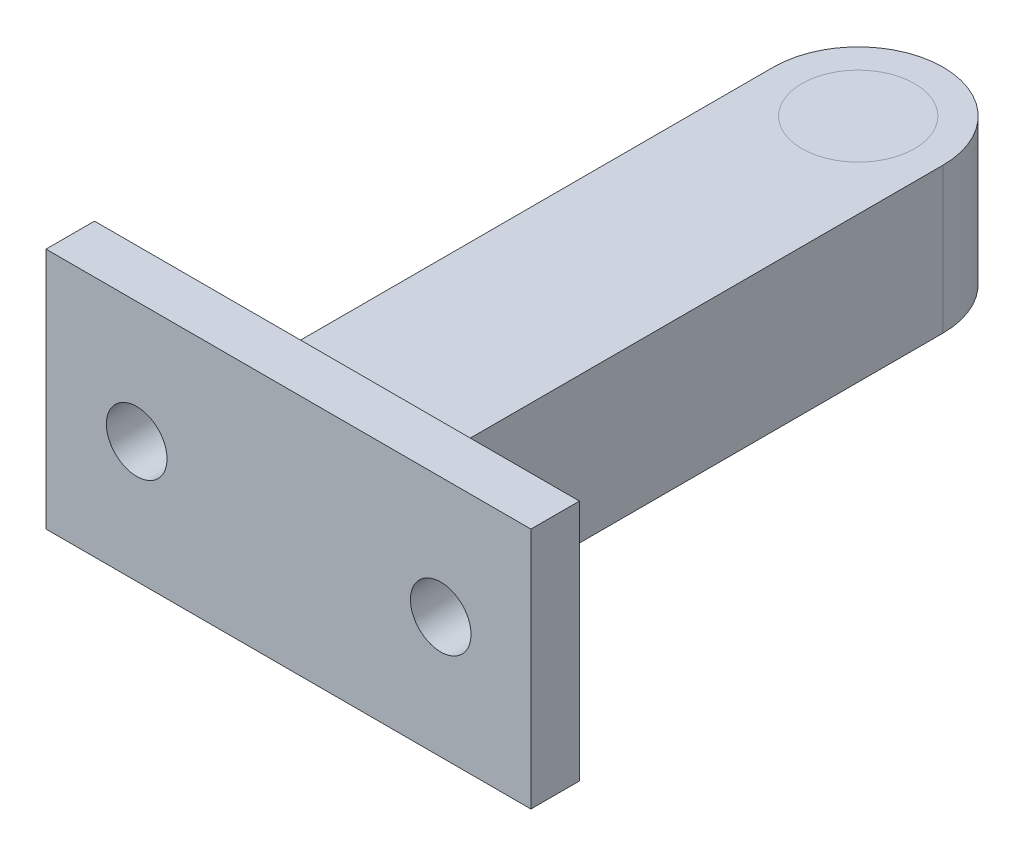
ISO-10303-21;
HEADER;
FILE_DESCRIPTION(('STEP AP214'),'2;1');
FILE_NAME('part.step','',(''),(''),'','','');
FILE_SCHEMA(('AUTOMOTIVE_DESIGN { 1 0 10303 214 1 1 1 1 }'));
ENDSEC;
DATA;
#1=APPLICATION_CONTEXT('core data for automotive mechanical design processes');
#2=APPLICATION_PROTOCOL_DEFINITION('international standard','automotive_design',2000,#1);
#3=PRODUCT_CONTEXT('',#1,'mechanical');
#4=PRODUCT('Part','Part','',(#3));
#5=PRODUCT_RELATED_PRODUCT_CATEGORY('part','',(#4));
#6=PRODUCT_DEFINITION_FORMATION('','',#4);
#7=PRODUCT_DEFINITION_CONTEXT('part definition',#1,'design');
#8=PRODUCT_DEFINITION('design','',#6,#7);
#9=PRODUCT_DEFINITION_SHAPE('','',#8);
#10=(LENGTH_UNIT() NAMED_UNIT(*) SI_UNIT(.MILLI.,.METRE.));
#11=(NAMED_UNIT(*) PLANE_ANGLE_UNIT() SI_UNIT($,.RADIAN.));
#12=(NAMED_UNIT(*) SI_UNIT($,.STERADIAN.) SOLID_ANGLE_UNIT());
#13=UNCERTAINTY_MEASURE_WITH_UNIT(LENGTH_MEASURE(1.E-05),#10,'distance_accuracy_value','');
#14=(GEOMETRIC_REPRESENTATION_CONTEXT(3) GLOBAL_UNCERTAINTY_ASSIGNED_CONTEXT((#13)) GLOBAL_UNIT_ASSIGNED_CONTEXT((#10,
#11,#12)) REPRESENTATION_CONTEXT('',''));
#15=CARTESIAN_POINT('',(0.,0.,0.));
#16=DIRECTION('',(0.,0.,1.));
#17=DIRECTION('',(1.,0.,0.));
#18=AXIS2_PLACEMENT_3D('',#15,#16,#17);
#19=CARTESIAN_POINT('',(0.,5.5,0.));
#20=DIRECTION('',(0.,1.,0.));
#21=DIRECTION('',(0.,0.,1.));
#22=AXIS2_PLACEMENT_3D('',#19,#20,#21);
#23=CYLINDRICAL_SURFACE('',#22,2.325);
#24=CARTESIAN_POINT('',(0.,5.5,0.));
#25=DIRECTION('',(0.,1.,0.));
#26=DIRECTION('',(0.,0.,1.));
#27=AXIS2_PLACEMENT_3D('',#24,#25,#26);
#28=CIRCLE('',#27,2.325);
#29=CARTESIAN_POINT('',(0.,5.5,2.325));
#30=VERTEX_POINT('',#29);
#31=EDGE_CURVE('E11',#30,#30,#28,.T.);
#32=ORIENTED_EDGE('',*,*,#31,.T.);
#33=EDGE_LOOP('',(#32));
#34=FACE_BOUND('',#33,.T.);
#35=CARTESIAN_POINT('',(0.,6.,0.));
#36=DIRECTION('',(0.,1.,0.));
#37=DIRECTION('',(0.,0.,1.));
#38=AXIS2_PLACEMENT_3D('',#35,#36,#37);
#39=CIRCLE('',#38,2.325);
#40=CARTESIAN_POINT('',(0.,6.,2.325));
#41=VERTEX_POINT('',#40);
#42=EDGE_CURVE('E58',#41,#41,#39,.T.);
#43=ORIENTED_EDGE('',*,*,#42,.F.);
#44=EDGE_LOOP('',(#43));
#45=FACE_BOUND('',#44,.T.);
#46=ADVANCED_FACE('F55',(#34,#45),#23,.T.);
#47=CARTESIAN_POINT('',(0.,5.5,0.));
#48=DIRECTION('',(0.,1.,0.));
#49=DIRECTION('',(0.,0.,1.));
#50=AXIS2_PLACEMENT_3D('',#47,#48,#49);
#51=PLANE('',#50);
#52=ORIENTED_EDGE('',*,*,#31,.F.);
#53=EDGE_LOOP('',(#52));
#54=FACE_BOUND('',#53,.T.);
#55=ADVANCED_FACE('F70',(#54),#51,.F.);
#56=CARTESIAN_POINT('',(0.,6.,0.));
#57=DIRECTION('',(0.,1.,0.));
#58=DIRECTION('',(0.,0.,1.));
#59=AXIS2_PLACEMENT_3D('',#56,#57,#58);
#60=PLANE('',#59);
#61=ORIENTED_EDGE('',*,*,#42,.T.);
#62=EDGE_LOOP('',(#61));
#63=FACE_BOUND('',#62,.T.);
#64=ADVANCED_FACE('F67',(#63),#60,.T.);
#65=CLOSED_SHELL('',(#46,#55,#64));
#66=MANIFOLD_SOLID_BREP('B2',#65);
#67=CARTESIAN_POINT('',(0.,0.,23.5));
#68=DIRECTION('',(0.,0.,1.));
#69=DIRECTION('',(1.,0.,0.));
#70=AXIS2_PLACEMENT_3D('',#67,#68,#69);
#71=PLANE('',#70);
#72=DIRECTION('',(0.,-1.,0.));
#73=VECTOR('',#72,1.);
#74=CARTESIAN_POINT('',(-10.,8.,23.5));
#75=LINE('',#74,#73);
#76=CARTESIAN_POINT('',(-10.,8.,23.5));
#77=VERTEX_POINT('',#76);
#78=CARTESIAN_POINT('',(-10.,-2.,23.5));
#79=VERTEX_POINT('',#78);
#80=EDGE_CURVE('E181',#77,#79,#75,.T.);
#81=ORIENTED_EDGE('',*,*,#80,.T.);
#82=DIRECTION('',(1.,0.,0.));
#83=VECTOR('',#82,1.);
#84=CARTESIAN_POINT('',(-10.,-2.,23.5));
#85=LINE('',#84,#83);
#86=CARTESIAN_POINT('',(10.,-2.,23.5));
#87=VERTEX_POINT('',#86);
#88=EDGE_CURVE('E169',#79,#87,#85,.T.);
#89=ORIENTED_EDGE('',*,*,#88,.T.);
#90=DIRECTION('',(0.,1.,0.));
#91=VECTOR('',#90,1.);
#92=CARTESIAN_POINT('',(10.,8.,23.5));
#93=LINE('',#92,#91);
#94=CARTESIAN_POINT('',(10.,8.,23.5));
#95=VERTEX_POINT('',#94);
#96=EDGE_CURVE('E180',#87,#95,#93,.T.);
#97=ORIENTED_EDGE('',*,*,#96,.T.);
#98=DIRECTION('',(-1.,0.,0.));
#99=VECTOR('',#98,1.);
#100=CARTESIAN_POINT('',(-10.,8.,23.5));
#101=LINE('',#100,#99);
#102=EDGE_CURVE('E186',#95,#77,#101,.T.);
#103=ORIENTED_EDGE('',*,*,#102,.T.);
#104=EDGE_LOOP('',(#81,#89,#97,#103));
#105=FACE_BOUND('',#104,.T.);
#106=CARTESIAN_POINT('',(-6.25766850005676,3.,23.5));
#107=DIRECTION('',(0.,0.,-1.));
#108=DIRECTION('',(-1.,0.,0.));
#109=AXIS2_PLACEMENT_3D('',#106,#107,#108);
#110=CIRCLE('',#109,1.25);
#111=CARTESIAN_POINT('',(-7.50766850005676,3.,23.5));
#112=VERTEX_POINT('',#111);
#113=EDGE_CURVE('E309',#112,#112,#110,.T.);
#114=ORIENTED_EDGE('',*,*,#113,.T.);
#115=EDGE_LOOP('',(#114));
#116=FACE_BOUND('',#115,.T.);
#117=CARTESIAN_POINT('',(6.28106165332799,3.,23.5));
#118=DIRECTION('',(0.,0.,-1.));
#119=DIRECTION('',(-1.,0.,0.));
#120=AXIS2_PLACEMENT_3D('',#117,#118,#119);
#121=CIRCLE('',#120,1.25);
#122=CARTESIAN_POINT('',(5.03106165332799,3.,23.5));
#123=VERTEX_POINT('',#122);
#124=EDGE_CURVE('E296',#123,#123,#121,.T.);
#125=ORIENTED_EDGE('',*,*,#124,.T.);
#126=EDGE_LOOP('',(#125));
#127=FACE_BOUND('',#126,.T.);
#128=ADVANCED_FACE('F96',(#105,#116,#127),#71,.T.);
#129=CARTESIAN_POINT('',(3.5,6.,0.));
#130=DIRECTION('',(1.,0.,0.));
#131=DIRECTION('',(0.,0.,-1.));
#132=AXIS2_PLACEMENT_3D('',#129,#130,#131);
#133=PLANE('',#132);
#134=DIRECTION('',(0.,0.,1.));
#135=VECTOR('',#134,1.);
#136=CARTESIAN_POINT('',(3.5,0.,0.));
#137=LINE('',#136,#135);
#138=CARTESIAN_POINT('',(3.5,0.,0.));
#139=VERTEX_POINT('',#138);
#140=CARTESIAN_POINT('',(3.5,0.,21.5));
#141=VERTEX_POINT('',#140);
#142=EDGE_CURVE('E202',#139,#141,#137,.T.);
#143=ORIENTED_EDGE('',*,*,#142,.F.);
#144=DIRECTION('',(0.,-1.,0.));
#145=VECTOR('',#144,1.);
#146=CARTESIAN_POINT('',(3.5,6.,0.));
#147=LINE('',#146,#145);
#148=CARTESIAN_POINT('',(3.5,6.,0.));
#149=VERTEX_POINT('',#148);
#150=EDGE_CURVE('E53',#149,#139,#147,.T.);
#151=ORIENTED_EDGE('',*,*,#150,.F.);
#152=DIRECTION('',(0.,0.,1.));
#153=VECTOR('',#152,1.);
#154=CARTESIAN_POINT('',(3.5,6.,0.));
#155=LINE('',#154,#153);
#156=CARTESIAN_POINT('',(3.5,6.,21.5));
#157=VERTEX_POINT('',#156);
#158=EDGE_CURVE('E212',#149,#157,#155,.T.);
#159=ORIENTED_EDGE('',*,*,#158,.T.);
#160=DIRECTION('',(0.,-1.,0.));
#161=VECTOR('',#160,1.);
#162=CARTESIAN_POINT('',(3.5,6.,21.5));
#163=LINE('',#162,#161);
#164=EDGE_CURVE('E135',#157,#141,#163,.T.);
#165=ORIENTED_EDGE('',*,*,#164,.T.);
#166=EDGE_LOOP('',(#143,#151,#159,#165));
#167=FACE_BOUND('',#166,.T.);
#168=ADVANCED_FACE('F249',(#167),#133,.T.);
#169=CARTESIAN_POINT('',(0.,6.,0.));
#170=DIRECTION('',(0.,-1.,0.));
#171=DIRECTION('',(0.,0.,-1.));
#172=AXIS2_PLACEMENT_3D('',#169,#170,#171);
#173=CYLINDRICAL_SURFACE('',#172,3.5);
#174=CARTESIAN_POINT('',(0.,0.,0.));
#175=DIRECTION('',(0.,1.,0.));
#176=DIRECTION('',(0.,0.,1.));
#177=AXIS2_PLACEMENT_3D('',#174,#175,#176);
#178=CIRCLE('',#177,3.5);
#179=CARTESIAN_POINT('',(-3.5,0.,0.));
#180=VERTEX_POINT('',#179);
#181=EDGE_CURVE('E227',#139,#180,#178,.T.);
#182=ORIENTED_EDGE('',*,*,#181,.T.);
#183=DIRECTION('',(0.,-1.,0.));
#184=VECTOR('',#183,1.);
#185=CARTESIAN_POINT('',(-3.5,6.,0.));
#186=LINE('',#185,#184);
#187=CARTESIAN_POINT('',(-3.5,6.,0.));
#188=VERTEX_POINT('',#187);
#189=EDGE_CURVE('E106',#188,#180,#186,.T.);
#190=ORIENTED_EDGE('',*,*,#189,.F.);
#191=CARTESIAN_POINT('',(0.,6.,0.));
#192=DIRECTION('',(0.,1.,0.));
#193=DIRECTION('',(0.,0.,1.));
#194=AXIS2_PLACEMENT_3D('',#191,#192,#193);
#195=CIRCLE('',#194,3.5);
#196=EDGE_CURVE('E216',#149,#188,#195,.T.);
#197=ORIENTED_EDGE('',*,*,#196,.F.);
#198=ORIENTED_EDGE('',*,*,#150,.T.);
#199=EDGE_LOOP('',(#182,#190,#197,#198));
#200=FACE_BOUND('',#199,.T.);
#201=ADVANCED_FACE('F247',(#200),#173,.T.);
#202=CARTESIAN_POINT('',(-3.5,6.,0.));
#203=DIRECTION('',(1.,0.,0.));
#204=DIRECTION('',(0.,0.,-1.));
#205=AXIS2_PLACEMENT_3D('',#202,#203,#204);
#206=PLANE('',#205);
#207=DIRECTION('',(0.,0.,1.));
#208=VECTOR('',#207,1.);
#209=CARTESIAN_POINT('',(-3.5,0.,0.));
#210=LINE('',#209,#208);
#211=CARTESIAN_POINT('',(-3.5,0.,21.5));
#212=VERTEX_POINT('',#211);
#213=EDGE_CURVE('E128',#180,#212,#210,.T.);
#214=ORIENTED_EDGE('',*,*,#213,.T.);
#215=DIRECTION('',(0.,-1.,0.));
#216=VECTOR('',#215,1.);
#217=CARTESIAN_POINT('',(-3.5,6.,21.5));
#218=LINE('',#217,#216);
#219=CARTESIAN_POINT('',(-3.5,6.,21.5));
#220=VERTEX_POINT('',#219);
#221=EDGE_CURVE('E238',#220,#212,#218,.T.);
#222=ORIENTED_EDGE('',*,*,#221,.F.);
#223=DIRECTION('',(0.,0.,1.));
#224=VECTOR('',#223,1.);
#225=CARTESIAN_POINT('',(-3.5,6.,0.));
#226=LINE('',#225,#224);
#227=EDGE_CURVE('E220',#188,#220,#226,.T.);
#228=ORIENTED_EDGE('',*,*,#227,.F.);
#229=ORIENTED_EDGE('',*,*,#189,.T.);
#230=EDGE_LOOP('',(#214,#222,#228,#229));
#231=FACE_BOUND('',#230,.T.);
#232=ADVANCED_FACE('F244',(#231),#206,.F.);
#233=CARTESIAN_POINT('',(0.,6.,0.));
#234=DIRECTION('',(0.,-1.,0.));
#235=DIRECTION('',(0.,0.,-1.));
#236=AXIS2_PLACEMENT_3D('',#233,#234,#235);
#237=CYLINDRICAL_SURFACE('',#236,2.325);
#238=CARTESIAN_POINT('',(0.,6.,0.));
#239=DIRECTION('',(0.,1.,0.));
#240=DIRECTION('',(0.,0.,1.));
#241=AXIS2_PLACEMENT_3D('',#238,#239,#240);
#242=CIRCLE('',#241,2.325);
#243=CARTESIAN_POINT('',(0.,6.,2.325));
#244=VERTEX_POINT('',#243);
#245=EDGE_CURVE('E208',#244,#244,#242,.T.);
#246=ORIENTED_EDGE('',*,*,#245,.T.);
#247=EDGE_LOOP('',(#246));
#248=FACE_BOUND('',#247,.T.);
#249=CARTESIAN_POINT('',(0.,0.,0.));
#250=DIRECTION('',(0.,1.,0.));
#251=DIRECTION('',(0.,0.,1.));
#252=AXIS2_PLACEMENT_3D('',#249,#250,#251);
#253=CIRCLE('',#252,2.325);
#254=CARTESIAN_POINT('',(0.,0.,2.325));
#255=VERTEX_POINT('',#254);
#256=EDGE_CURVE('E197',#255,#255,#253,.T.);
#257=ORIENTED_EDGE('',*,*,#256,.F.);
#258=EDGE_LOOP('',(#257));
#259=FACE_BOUND('',#258,.T.);
#260=ADVANCED_FACE('F98',(#248,#259),#237,.F.);
#261=CARTESIAN_POINT('',(0.,6.,0.));
#262=DIRECTION('',(0.,1.,0.));
#263=DIRECTION('',(0.,0.,1.));
#264=AXIS2_PLACEMENT_3D('',#261,#262,#263);
#265=PLANE('',#264);
#266=ORIENTED_EDGE('',*,*,#245,.F.);
#267=EDGE_LOOP('',(#266));
#268=FACE_BOUND('',#267,.T.);
#269=ORIENTED_EDGE('',*,*,#158,.F.);
#270=ORIENTED_EDGE('',*,*,#196,.T.);
#271=ORIENTED_EDGE('',*,*,#227,.T.);
#272=DIRECTION('',(1.,0.,0.));
#273=VECTOR('',#272,1.);
#274=CARTESIAN_POINT('',(0.,6.,21.5));
#275=LINE('',#274,#273);
#276=EDGE_CURVE('E114',#220,#157,#275,.T.);
#277=ORIENTED_EDGE('',*,*,#276,.T.);
#278=EDGE_LOOP('',(#269,#270,#271,#277));
#279=FACE_BOUND('',#278,.T.);
#280=ADVANCED_FACE('F264',(#268,#279),#265,.T.);
#281=CARTESIAN_POINT('',(0.,0.,0.));
#282=DIRECTION('',(0.,1.,0.));
#283=DIRECTION('',(0.,0.,1.));
#284=AXIS2_PLACEMENT_3D('',#281,#282,#283);
#285=PLANE('',#284);
#286=ORIENTED_EDGE('',*,*,#256,.T.);
#287=EDGE_LOOP('',(#286));
#288=FACE_BOUND('',#287,.T.);
#289=ORIENTED_EDGE('',*,*,#142,.T.);
#290=DIRECTION('',(1.,0.,0.));
#291=VECTOR('',#290,1.);
#292=CARTESIAN_POINT('',(0.,0.,21.5));
#293=LINE('',#292,#291);
#294=EDGE_CURVE('E213',#212,#141,#293,.T.);
#295=ORIENTED_EDGE('',*,*,#294,.F.);
#296=ORIENTED_EDGE('',*,*,#213,.F.);
#297=ORIENTED_EDGE('',*,*,#181,.F.);
#298=EDGE_LOOP('',(#289,#295,#296,#297));
#299=FACE_BOUND('',#298,.T.);
#300=ADVANCED_FACE('F248',(#288,#299),#285,.F.);
#301=CARTESIAN_POINT('',(0.,0.,21.5));
#302=DIRECTION('',(0.,0.,1.));
#303=DIRECTION('',(1.,0.,0.));
#304=AXIS2_PLACEMENT_3D('',#301,#302,#303);
#305=PLANE('',#304);
#306=CARTESIAN_POINT('',(6.28106165332799,3.,21.5));
#307=DIRECTION('',(0.,0.,-1.));
#308=DIRECTION('',(-1.,0.,0.));
#309=AXIS2_PLACEMENT_3D('',#306,#307,#308);
#310=CIRCLE('',#309,1.25);
#311=CARTESIAN_POINT('',(5.03106165332799,3.,21.5));
#312=VERTEX_POINT('',#311);
#313=EDGE_CURVE('E299',#312,#312,#310,.T.);
#314=ORIENTED_EDGE('',*,*,#313,.F.);
#315=EDGE_LOOP('',(#314));
#316=FACE_BOUND('',#315,.T.);
#317=CARTESIAN_POINT('',(-6.25766850005676,3.,21.5));
#318=DIRECTION('',(0.,0.,-1.));
#319=DIRECTION('',(-1.,0.,0.));
#320=AXIS2_PLACEMENT_3D('',#317,#318,#319);
#321=CIRCLE('',#320,1.25);
#322=CARTESIAN_POINT('',(-7.50766850005676,3.,21.5));
#323=VERTEX_POINT('',#322);
#324=EDGE_CURVE('E303',#323,#323,#321,.T.);
#325=ORIENTED_EDGE('',*,*,#324,.F.);
#326=EDGE_LOOP('',(#325));
#327=FACE_BOUND('',#326,.T.);
#328=DIRECTION('',(0.,-1.,0.));
#329=VECTOR('',#328,1.);
#330=CARTESIAN_POINT('',(-10.,8.,21.5));
#331=LINE('',#330,#329);
#332=CARTESIAN_POINT('',(-10.,8.,21.5));
#333=VERTEX_POINT('',#332);
#334=CARTESIAN_POINT('',(-10.,-2.,21.5));
#335=VERTEX_POINT('',#334);
#336=EDGE_CURVE('E195',#333,#335,#331,.T.);
#337=ORIENTED_EDGE('',*,*,#336,.F.);
#338=DIRECTION('',(-1.,0.,0.));
#339=VECTOR('',#338,1.);
#340=CARTESIAN_POINT('',(-10.,8.,21.5));
#341=LINE('',#340,#339);
#342=CARTESIAN_POINT('',(10.,8.,21.5));
#343=VERTEX_POINT('',#342);
#344=EDGE_CURVE('E191',#343,#333,#341,.T.);
#345=ORIENTED_EDGE('',*,*,#344,.F.);
#346=DIRECTION('',(0.,1.,0.));
#347=VECTOR('',#346,1.);
#348=CARTESIAN_POINT('',(10.,8.,21.5));
#349=LINE('',#348,#347);
#350=CARTESIAN_POINT('',(10.,-2.,21.5));
#351=VERTEX_POINT('',#350);
#352=EDGE_CURVE('E323',#351,#343,#349,.T.);
#353=ORIENTED_EDGE('',*,*,#352,.F.);
#354=DIRECTION('',(1.,0.,0.));
#355=VECTOR('',#354,1.);
#356=CARTESIAN_POINT('',(-10.,-2.,21.5));
#357=LINE('',#356,#355);
#358=EDGE_CURVE('E320',#335,#351,#357,.T.);
#359=ORIENTED_EDGE('',*,*,#358,.F.);
#360=EDGE_LOOP('',(#337,#345,#353,#359));
#361=FACE_BOUND('',#360,.T.);
#362=ORIENTED_EDGE('',*,*,#221,.T.);
#363=ORIENTED_EDGE('',*,*,#294,.T.);
#364=ORIENTED_EDGE('',*,*,#164,.F.);
#365=ORIENTED_EDGE('',*,*,#276,.F.);
#366=EDGE_LOOP('',(#362,#363,#364,#365));
#367=FACE_BOUND('',#366,.T.);
#368=ADVANCED_FACE('F263',(#316,#327,#361,#367),#305,.F.);
#369=CARTESIAN_POINT('',(-10.,8.,23.5));
#370=DIRECTION('',(1.,0.,0.));
#371=DIRECTION('',(0.,1.,0.));
#372=AXIS2_PLACEMENT_3D('',#369,#370,#371);
#373=PLANE('',#372);
#374=ORIENTED_EDGE('',*,*,#336,.T.);
#375=DIRECTION('',(0.,0.,-1.));
#376=VECTOR('',#375,1.);
#377=CARTESIAN_POINT('',(-10.,-2.,23.5));
#378=LINE('',#377,#376);
#379=EDGE_CURVE('E173',#79,#335,#378,.T.);
#380=ORIENTED_EDGE('',*,*,#379,.F.);
#381=ORIENTED_EDGE('',*,*,#80,.F.);
#382=DIRECTION('',(0.,0.,-1.));
#383=VECTOR('',#382,1.);
#384=CARTESIAN_POINT('',(-10.,8.,23.5));
#385=LINE('',#384,#383);
#386=EDGE_CURVE('E317',#77,#333,#385,.T.);
#387=ORIENTED_EDGE('',*,*,#386,.T.);
#388=EDGE_LOOP('',(#374,#380,#381,#387));
#389=FACE_BOUND('',#388,.T.);
#390=ADVANCED_FACE('F193',(#389),#373,.F.);
#391=CARTESIAN_POINT('',(-10.,-2.,23.5));
#392=DIRECTION('',(0.,1.,0.));
#393=DIRECTION('',(0.,0.,1.));
#394=AXIS2_PLACEMENT_3D('',#391,#392,#393);
#395=PLANE('',#394);
#396=ORIENTED_EDGE('',*,*,#358,.T.);
#397=DIRECTION('',(0.,0.,-1.));
#398=VECTOR('',#397,1.);
#399=CARTESIAN_POINT('',(10.,-2.,23.5));
#400=LINE('',#399,#398);
#401=EDGE_CURVE('E176',#87,#351,#400,.T.);
#402=ORIENTED_EDGE('',*,*,#401,.F.);
#403=ORIENTED_EDGE('',*,*,#88,.F.);
#404=ORIENTED_EDGE('',*,*,#379,.T.);
#405=EDGE_LOOP('',(#396,#402,#403,#404));
#406=FACE_BOUND('',#405,.T.);
#407=ADVANCED_FACE('F171',(#406),#395,.F.);
#408=CARTESIAN_POINT('',(10.,8.,23.5));
#409=DIRECTION('',(-1.,0.,0.));
#410=DIRECTION('',(0.,0.,1.));
#411=AXIS2_PLACEMENT_3D('',#408,#409,#410);
#412=PLANE('',#411);
#413=ORIENTED_EDGE('',*,*,#352,.T.);
#414=DIRECTION('',(0.,0.,-1.));
#415=VECTOR('',#414,1.);
#416=CARTESIAN_POINT('',(10.,8.,23.5));
#417=LINE('',#416,#415);
#418=EDGE_CURVE('E204',#95,#343,#417,.T.);
#419=ORIENTED_EDGE('',*,*,#418,.F.);
#420=ORIENTED_EDGE('',*,*,#96,.F.);
#421=ORIENTED_EDGE('',*,*,#401,.T.);
#422=EDGE_LOOP('',(#413,#419,#420,#421));
#423=FACE_BOUND('',#422,.T.);
#424=ADVANCED_FACE('F273',(#423),#412,.F.);
#425=CARTESIAN_POINT('',(-10.,8.,23.5));
#426=DIRECTION('',(0.,-1.,0.));
#427=DIRECTION('',(0.,0.,-1.));
#428=AXIS2_PLACEMENT_3D('',#425,#426,#427);
#429=PLANE('',#428);
#430=ORIENTED_EDGE('',*,*,#344,.T.);
#431=ORIENTED_EDGE('',*,*,#386,.F.);
#432=ORIENTED_EDGE('',*,*,#102,.F.);
#433=ORIENTED_EDGE('',*,*,#418,.T.);
#434=EDGE_LOOP('',(#430,#431,#432,#433));
#435=FACE_BOUND('',#434,.T.);
#436=ADVANCED_FACE('F276',(#435),#429,.F.);
#437=CARTESIAN_POINT('',(-6.25766850005676,3.,21.5));
#438=DIRECTION('',(0.,0.,-1.));
#439=DIRECTION('',(-1.,0.,0.));
#440=AXIS2_PLACEMENT_3D('',#437,#438,#439);
#441=CYLINDRICAL_SURFACE('',#440,1.25);
#442=ORIENTED_EDGE('',*,*,#113,.F.);
#443=EDGE_LOOP('',(#442));
#444=FACE_BOUND('',#443,.T.);
#445=ORIENTED_EDGE('',*,*,#324,.T.);
#446=EDGE_LOOP('',(#445));
#447=FACE_BOUND('',#446,.T.);
#448=ADVANCED_FACE('F280',(#444,#447),#441,.F.);
#449=CARTESIAN_POINT('',(6.28106165332799,3.,21.5));
#450=DIRECTION('',(0.,0.,-1.));
#451=DIRECTION('',(-1.,0.,0.));
#452=AXIS2_PLACEMENT_3D('',#449,#450,#451);
#453=CYLINDRICAL_SURFACE('',#452,1.25);
#454=ORIENTED_EDGE('',*,*,#124,.F.);
#455=EDGE_LOOP('',(#454));
#456=FACE_BOUND('',#455,.T.);
#457=ORIENTED_EDGE('',*,*,#313,.T.);
#458=EDGE_LOOP('',(#457));
#459=FACE_BOUND('',#458,.T.);
#460=ADVANCED_FACE('F287',(#456,#459),#453,.F.);
#461=CLOSED_SHELL('',(#128,#168,#201,#232,#260,#280,#300,#368,#390,#407,#424,#436,#448,#460));
#462=MANIFOLD_SOLID_BREP('B6',#461);
#463=ADVANCED_BREP_SHAPE_REPRESENTATION('',(#18,#66,#462),#14);
#464=SHAPE_DEFINITION_REPRESENTATION(#9,#463);
ENDSEC;
END-ISO-10303-21;
